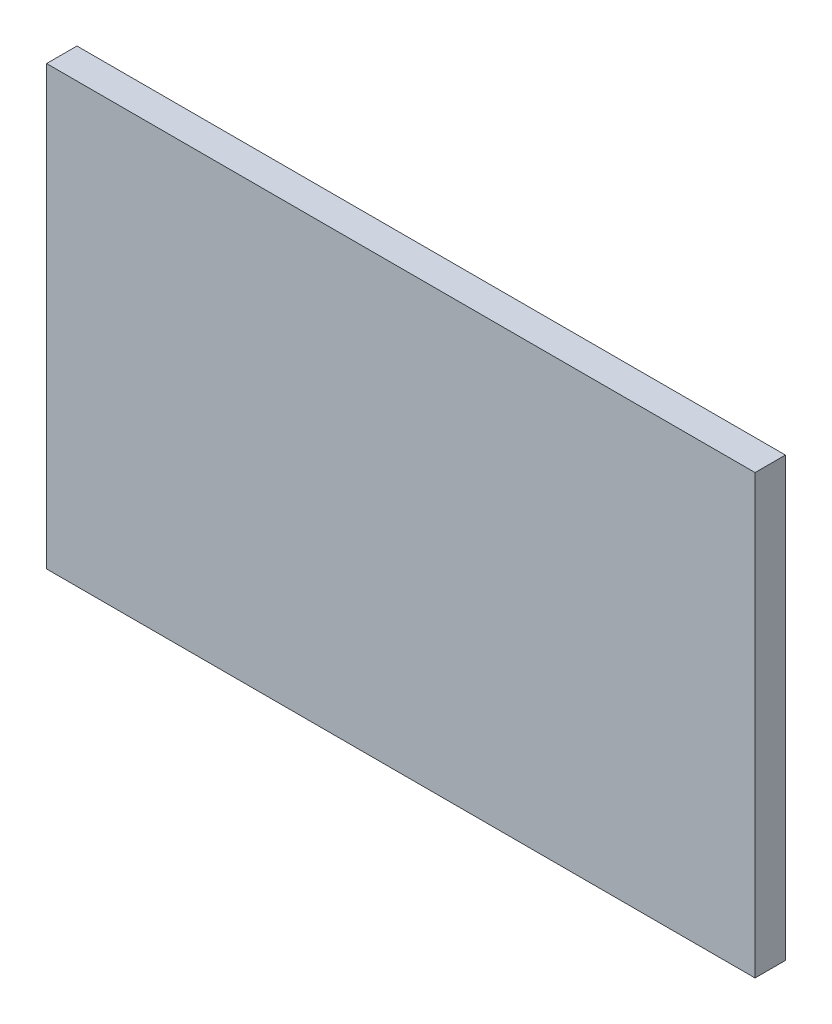
ISO-10303-21;
HEADER;
FILE_DESCRIPTION(('STEP AP214'),'2;1');
FILE_NAME('part.step','',(''),(''),'','','');
FILE_SCHEMA(('AUTOMOTIVE_DESIGN { 1 0 10303 214 1 1 1 1 }'));
ENDSEC;
DATA;
#1=APPLICATION_CONTEXT('core data for automotive mechanical design processes');
#2=APPLICATION_PROTOCOL_DEFINITION('international standard','automotive_design',2000,#1);
#3=PRODUCT_CONTEXT('',#1,'mechanical');
#4=PRODUCT('Part','Part','',(#3));
#5=PRODUCT_RELATED_PRODUCT_CATEGORY('part','',(#4));
#6=PRODUCT_DEFINITION_FORMATION('','',#4);
#7=PRODUCT_DEFINITION_CONTEXT('part definition',#1,'design');
#8=PRODUCT_DEFINITION('design','',#6,#7);
#9=PRODUCT_DEFINITION_SHAPE('','',#8);
#10=(LENGTH_UNIT() NAMED_UNIT(*) SI_UNIT(.MILLI.,.METRE.));
#11=(NAMED_UNIT(*) PLANE_ANGLE_UNIT() SI_UNIT($,.RADIAN.));
#12=(NAMED_UNIT(*) SI_UNIT($,.STERADIAN.) SOLID_ANGLE_UNIT());
#13=UNCERTAINTY_MEASURE_WITH_UNIT(LENGTH_MEASURE(1.E-05),#10,'distance_accuracy_value','');
#14=(GEOMETRIC_REPRESENTATION_CONTEXT(3) GLOBAL_UNCERTAINTY_ASSIGNED_CONTEXT((#13)) GLOBAL_UNIT_ASSIGNED_CONTEXT((#10,
#11,#12)) REPRESENTATION_CONTEXT('',''));
#15=CARTESIAN_POINT('',(0.,0.,0.));
#16=DIRECTION('',(0.,0.,1.));
#17=DIRECTION('',(1.,0.,0.));
#18=AXIS2_PLACEMENT_3D('',#15,#16,#17);
#19=CARTESIAN_POINT('',(-47.2,-9.9,-4.37));
#20=DIRECTION('',(-1.,0.,0.));
#21=DIRECTION('',(0.,0.,1.));
#22=AXIS2_PLACEMENT_3D('',#19,#20,#21);
#23=PLANE('',#22);
#24=DIRECTION('',(0.,-1.,0.));
#25=VECTOR('',#24,1.);
#26=CARTESIAN_POINT('',(-47.2,-9.9,-3.17));
#27=LINE('',#26,#25);
#28=CARTESIAN_POINT('',(-47.2,-9.9,-3.17));
#29=VERTEX_POINT('',#28);
#30=CARTESIAN_POINT('',(-47.2,-27.2,-3.17));
#31=VERTEX_POINT('',#30);
#32=EDGE_CURVE('E205',#29,#31,#27,.T.);
#33=ORIENTED_EDGE('',*,*,#32,.F.);
#34=DIRECTION('',(0.,0.,1.));
#35=VECTOR('',#34,1.);
#36=CARTESIAN_POINT('',(-47.2,-9.9,-4.37));
#37=LINE('',#36,#35);
#38=CARTESIAN_POINT('',(-47.2,-9.9,-4.37));
#39=VERTEX_POINT('',#38);
#40=EDGE_CURVE('E50',#39,#29,#37,.T.);
#41=ORIENTED_EDGE('',*,*,#40,.F.);
#42=DIRECTION('',(0.,-1.,0.));
#43=VECTOR('',#42,1.);
#44=CARTESIAN_POINT('',(-47.2,-9.9,-4.37));
#45=LINE('',#44,#43);
#46=CARTESIAN_POINT('',(-47.2,-14.08,-4.37));
#47=VERTEX_POINT('',#46);
#48=EDGE_CURVE('E208',#39,#47,#45,.T.);
#49=ORIENTED_EDGE('',*,*,#48,.T.);
#50=CARTESIAN_POINT('',(-47.2,-23.02,-4.37));
#51=VERTEX_POINT('',#50);
#52=EDGE_CURVE('E215',#47,#51,#45,.T.);
#53=ORIENTED_EDGE('',*,*,#52,.T.);
#54=CARTESIAN_POINT('',(-47.2,-27.2,-4.37));
#55=VERTEX_POINT('',#54);
#56=EDGE_CURVE('E213',#51,#55,#45,.T.);
#57=ORIENTED_EDGE('',*,*,#56,.T.);
#58=DIRECTION('',(0.,0.,1.));
#59=VECTOR('',#58,1.);
#60=CARTESIAN_POINT('',(-47.2,-27.2,-4.37));
#61=LINE('',#60,#59);
#62=EDGE_CURVE('E45',#55,#31,#61,.T.);
#63=ORIENTED_EDGE('',*,*,#62,.T.);
#64=EDGE_LOOP('',(#33,#41,#49,#53,#57,#63));
#65=FACE_BOUND('',#64,.T.);
#66=ADVANCED_FACE('F39',(#65),#23,.T.);
#67=CARTESIAN_POINT('',(-19.2,-9.9,-4.37));
#68=DIRECTION('',(0.,1.,0.));
#69=DIRECTION('',(0.,0.,1.));
#70=AXIS2_PLACEMENT_3D('',#67,#68,#69);
#71=PLANE('',#70);
#72=DIRECTION('',(-1.,0.,0.));
#73=VECTOR('',#72,1.);
#74=CARTESIAN_POINT('',(-19.2,-9.9,-3.17));
#75=LINE('',#74,#73);
#76=CARTESIAN_POINT('',(-19.2,-9.9,-3.17));
#77=VERTEX_POINT('',#76);
#78=EDGE_CURVE('E228',#77,#29,#75,.T.);
#79=ORIENTED_EDGE('',*,*,#78,.F.);
#80=DIRECTION('',(0.,0.,1.));
#81=VECTOR('',#80,1.);
#82=CARTESIAN_POINT('',(-19.2,-9.9,-4.37));
#83=LINE('',#82,#81);
#84=CARTESIAN_POINT('',(-19.2,-9.9,-4.37));
#85=VERTEX_POINT('',#84);
#86=EDGE_CURVE('E234',#85,#77,#83,.T.);
#87=ORIENTED_EDGE('',*,*,#86,.F.);
#88=DIRECTION('',(-1.,0.,0.));
#89=VECTOR('',#88,1.);
#90=CARTESIAN_POINT('',(-19.2,-9.9,-4.37));
#91=LINE('',#90,#89);
#92=EDGE_CURVE('E218',#85,#39,#91,.T.);
#93=ORIENTED_EDGE('',*,*,#92,.T.);
#94=ORIENTED_EDGE('',*,*,#40,.T.);
#95=EDGE_LOOP('',(#79,#87,#93,#94));
#96=FACE_BOUND('',#95,.T.);
#97=ADVANCED_FACE('F246',(#96),#71,.T.);
#98=CARTESIAN_POINT('',(-19.2,-27.2,-4.37));
#99=DIRECTION('',(1.,0.,0.));
#100=DIRECTION('',(0.,0.,-1.));
#101=AXIS2_PLACEMENT_3D('',#98,#99,#100);
#102=PLANE('',#101);
#103=DIRECTION('',(0.,1.,0.));
#104=VECTOR('',#103,1.);
#105=CARTESIAN_POINT('',(-19.2,-27.2,-3.17));
#106=LINE('',#105,#104);
#107=CARTESIAN_POINT('',(-19.2,-27.2,-3.17));
#108=VERTEX_POINT('',#107);
#109=EDGE_CURVE('E230',#108,#77,#106,.T.);
#110=ORIENTED_EDGE('',*,*,#109,.F.);
#111=DIRECTION('',(0.,0.,1.));
#112=VECTOR('',#111,1.);
#113=CARTESIAN_POINT('',(-19.2,-27.2,-4.37));
#114=LINE('',#113,#112);
#115=CARTESIAN_POINT('',(-19.2,-27.2,-4.37));
#116=VERTEX_POINT('',#115);
#117=EDGE_CURVE('E231',#116,#108,#114,.T.);
#118=ORIENTED_EDGE('',*,*,#117,.F.);
#119=DIRECTION('',(0.,1.,0.));
#120=VECTOR('',#119,1.);
#121=CARTESIAN_POINT('',(-19.2,-27.2,-4.37));
#122=LINE('',#121,#120);
#123=EDGE_CURVE('E216',#116,#85,#122,.T.);
#124=ORIENTED_EDGE('',*,*,#123,.T.);
#125=ORIENTED_EDGE('',*,*,#86,.T.);
#126=EDGE_LOOP('',(#110,#118,#124,#125));
#127=FACE_BOUND('',#126,.T.);
#128=ADVANCED_FACE('F273',(#127),#102,.T.);
#129=CARTESIAN_POINT('',(-47.2,-27.2,-4.37));
#130=DIRECTION('',(0.,-1.,0.));
#131=DIRECTION('',(0.,0.,-1.));
#132=AXIS2_PLACEMENT_3D('',#129,#130,#131);
#133=PLANE('',#132);
#134=DIRECTION('',(1.,0.,0.));
#135=VECTOR('',#134,1.);
#136=CARTESIAN_POINT('',(-47.2,-27.2,-3.17));
#137=LINE('',#136,#135);
#138=EDGE_CURVE('E221',#31,#108,#137,.T.);
#139=ORIENTED_EDGE('',*,*,#138,.F.);
#140=ORIENTED_EDGE('',*,*,#62,.F.);
#141=DIRECTION('',(1.,0.,0.));
#142=VECTOR('',#141,1.);
#143=CARTESIAN_POINT('',(-47.2,-27.2,-4.37));
#144=LINE('',#143,#142);
#145=EDGE_CURVE('E211',#55,#116,#144,.T.);
#146=ORIENTED_EDGE('',*,*,#145,.T.);
#147=ORIENTED_EDGE('',*,*,#117,.T.);
#148=EDGE_LOOP('',(#139,#140,#146,#147));
#149=FACE_BOUND('',#148,.T.);
#150=ADVANCED_FACE('F243',(#149),#133,.T.);
#151=CARTESIAN_POINT('',(0.,0.,-4.37));
#152=DIRECTION('',(0.,0.,1.));
#153=DIRECTION('',(1.,0.,0.));
#154=AXIS2_PLACEMENT_3D('',#151,#152,#153);
#155=PLANE('',#154);
#156=DIRECTION('',(-1.,0.,0.));
#157=VECTOR('',#156,1.);
#158=CARTESIAN_POINT('',(-31.2,-16.05,-4.37));
#159=LINE('',#158,#157);
#160=CARTESIAN_POINT('',(-31.2,-16.05,-4.37));
#161=VERTEX_POINT('',#160);
#162=CARTESIAN_POINT('',(-36.2,-16.05,-4.37));
#163=VERTEX_POINT('',#162);
#164=EDGE_CURVE('E165',#161,#163,#159,.T.);
#165=ORIENTED_EDGE('',*,*,#164,.T.);
#166=DIRECTION('',(0.,-1.,0.));
#167=VECTOR('',#166,1.);
#168=CARTESIAN_POINT('',(-36.2,-16.05,-4.37));
#169=LINE('',#168,#167);
#170=CARTESIAN_POINT('',(-36.2,-21.05,-4.37));
#171=VERTEX_POINT('',#170);
#172=EDGE_CURVE('E166',#163,#171,#169,.T.);
#173=ORIENTED_EDGE('',*,*,#172,.T.);
#174=DIRECTION('',(1.,0.,0.));
#175=VECTOR('',#174,1.);
#176=CARTESIAN_POINT('',(-36.2,-21.05,-4.37));
#177=LINE('',#176,#175);
#178=CARTESIAN_POINT('',(-31.2,-21.05,-4.37));
#179=VERTEX_POINT('',#178);
#180=EDGE_CURVE('E142',#171,#179,#177,.T.);
#181=ORIENTED_EDGE('',*,*,#180,.T.);
#182=DIRECTION('',(0.,1.,0.));
#183=VECTOR('',#182,1.);
#184=CARTESIAN_POINT('',(-31.2,-21.05,-4.37));
#185=LINE('',#184,#183);
#186=EDGE_CURVE('E57',#179,#161,#185,.T.);
#187=ORIENTED_EDGE('',*,*,#186,.T.);
#188=EDGE_LOOP('',(#165,#173,#181,#187));
#189=FACE_BOUND('',#188,.T.);
#190=ORIENTED_EDGE('',*,*,#56,.F.);
#191=DIRECTION('',(1.,0.,0.));
#192=VECTOR('',#191,1.);
#193=CARTESIAN_POINT('',(-48.,-23.02,-4.37));
#194=LINE('',#193,#192);
#195=CARTESIAN_POINT('',(-40.65,-23.02,-4.37));
#196=VERTEX_POINT('',#195);
#197=EDGE_CURVE('E11',#51,#196,#194,.T.);
#198=ORIENTED_EDGE('',*,*,#197,.T.);
#199=DIRECTION('',(0.,1.,0.));
#200=VECTOR('',#199,1.);
#201=CARTESIAN_POINT('',(-40.65,-23.02,-4.37));
#202=LINE('',#201,#200);
#203=CARTESIAN_POINT('',(-40.65,-14.08,-4.37));
#204=VERTEX_POINT('',#203);
#205=EDGE_CURVE('E191',#196,#204,#202,.T.);
#206=ORIENTED_EDGE('',*,*,#205,.T.);
#207=DIRECTION('',(-1.,0.,0.));
#208=VECTOR('',#207,1.);
#209=CARTESIAN_POINT('',(-40.65,-14.08,-4.37));
#210=LINE('',#209,#208);
#211=EDGE_CURVE('E185',#204,#47,#210,.T.);
#212=ORIENTED_EDGE('',*,*,#211,.T.);
#213=ORIENTED_EDGE('',*,*,#48,.F.);
#214=ORIENTED_EDGE('',*,*,#92,.F.);
#215=ORIENTED_EDGE('',*,*,#123,.F.);
#216=ORIENTED_EDGE('',*,*,#145,.F.);
#217=EDGE_LOOP('',(#190,#198,#206,#212,#213,#214,#215,#216));
#218=FACE_BOUND('',#217,.T.);
#219=ADVANCED_FACE('F255',(#189,#218),#155,.F.);
#220=CARTESIAN_POINT('',(0.,0.,-3.17));
#221=DIRECTION('',(0.,0.,1.));
#222=DIRECTION('',(1.,0.,0.));
#223=AXIS2_PLACEMENT_3D('',#220,#221,#222);
#224=PLANE('',#223);
#225=ORIENTED_EDGE('',*,*,#32,.T.);
#226=ORIENTED_EDGE('',*,*,#138,.T.);
#227=ORIENTED_EDGE('',*,*,#109,.T.);
#228=ORIENTED_EDGE('',*,*,#78,.T.);
#229=EDGE_LOOP('',(#225,#226,#227,#228));
#230=FACE_BOUND('',#229,.T.);
#231=ADVANCED_FACE('F250',(#230),#224,.T.);
#232=CARTESIAN_POINT('',(0.,0.,-4.37));
#233=DIRECTION('',(0.,0.,1.));
#234=DIRECTION('',(1.,0.,0.));
#235=AXIS2_PLACEMENT_3D('',#232,#233,#234);
#236=PLANE('',#235);
#237=ORIENTED_EDGE('',*,*,#52,.F.);
#238=CARTESIAN_POINT('',(-48.,-14.08,-4.37));
#239=VERTEX_POINT('',#238);
#240=EDGE_CURVE('E61',#47,#239,#210,.T.);
#241=ORIENTED_EDGE('',*,*,#240,.T.);
#242=DIRECTION('',(0.,-1.,0.));
#243=VECTOR('',#242,1.);
#244=CARTESIAN_POINT('',(-48.,-14.08,-4.37));
#245=LINE('',#244,#243);
#246=CARTESIAN_POINT('',(-48.,-23.02,-4.37));
#247=VERTEX_POINT('',#246);
#248=EDGE_CURVE('E171',#239,#247,#245,.T.);
#249=ORIENTED_EDGE('',*,*,#248,.T.);
#250=EDGE_CURVE('E47',#247,#51,#194,.T.);
#251=ORIENTED_EDGE('',*,*,#250,.T.);
#252=EDGE_LOOP('',(#237,#241,#249,#251));
#253=FACE_BOUND('',#252,.T.);
#254=ADVANCED_FACE('F271',(#253),#236,.T.);
#255=CARTESIAN_POINT('',(-48.,-14.08,-7.63));
#256=DIRECTION('',(-1.,0.,0.));
#257=DIRECTION('',(0.,0.,1.));
#258=AXIS2_PLACEMENT_3D('',#255,#256,#257);
#259=PLANE('',#258);
#260=ORIENTED_EDGE('',*,*,#248,.F.);
#261=DIRECTION('',(0.,0.,1.));
#262=VECTOR('',#261,1.);
#263=CARTESIAN_POINT('',(-48.,-14.08,-7.63));
#264=LINE('',#263,#262);
#265=CARTESIAN_POINT('',(-48.,-14.08,-7.63));
#266=VERTEX_POINT('',#265);
#267=EDGE_CURVE('E199',#266,#239,#264,.T.);
#268=ORIENTED_EDGE('',*,*,#267,.F.);
#269=DIRECTION('',(0.,-1.,0.));
#270=VECTOR('',#269,1.);
#271=CARTESIAN_POINT('',(-48.,-14.08,-7.63));
#272=LINE('',#271,#270);
#273=CARTESIAN_POINT('',(-48.,-23.02,-7.63));
#274=VERTEX_POINT('',#273);
#275=EDGE_CURVE('E178',#266,#274,#272,.T.);
#276=ORIENTED_EDGE('',*,*,#275,.T.);
#277=DIRECTION('',(0.,0.,1.));
#278=VECTOR('',#277,1.);
#279=CARTESIAN_POINT('',(-48.,-23.02,-7.63));
#280=LINE('',#279,#278);
#281=EDGE_CURVE('E192',#274,#247,#280,.T.);
#282=ORIENTED_EDGE('',*,*,#281,.T.);
#283=EDGE_LOOP('',(#260,#268,#276,#282));
#284=FACE_BOUND('',#283,.T.);
#285=ADVANCED_FACE('F268',(#284),#259,.T.);
#286=CARTESIAN_POINT('',(-40.65,-14.08,-7.63));
#287=DIRECTION('',(0.,1.,0.));
#288=DIRECTION('',(0.,0.,1.));
#289=AXIS2_PLACEMENT_3D('',#286,#287,#288);
#290=PLANE('',#289);
#291=ORIENTED_EDGE('',*,*,#211,.F.);
#292=DIRECTION('',(0.,0.,1.));
#293=VECTOR('',#292,1.);
#294=CARTESIAN_POINT('',(-40.65,-14.08,-7.63));
#295=LINE('',#294,#293);
#296=CARTESIAN_POINT('',(-40.65,-14.08,-7.63));
#297=VERTEX_POINT('',#296);
#298=EDGE_CURVE('E201',#297,#204,#295,.T.);
#299=ORIENTED_EDGE('',*,*,#298,.F.);
#300=DIRECTION('',(-1.,0.,0.));
#301=VECTOR('',#300,1.);
#302=CARTESIAN_POINT('',(-40.65,-14.08,-7.63));
#303=LINE('',#302,#301);
#304=EDGE_CURVE('E189',#297,#266,#303,.T.);
#305=ORIENTED_EDGE('',*,*,#304,.T.);
#306=ORIENTED_EDGE('',*,*,#267,.T.);
#307=ORIENTED_EDGE('',*,*,#240,.F.);
#308=EDGE_LOOP('',(#291,#299,#305,#306,#307));
#309=FACE_BOUND('',#308,.T.);
#310=ADVANCED_FACE('F260',(#309),#290,.T.);
#311=CARTESIAN_POINT('',(-40.65,-23.02,-7.63));
#312=DIRECTION('',(1.,0.,0.));
#313=DIRECTION('',(0.,0.,-1.));
#314=AXIS2_PLACEMENT_3D('',#311,#312,#313);
#315=PLANE('',#314);
#316=ORIENTED_EDGE('',*,*,#205,.F.);
#317=DIRECTION('',(0.,0.,1.));
#318=VECTOR('',#317,1.);
#319=CARTESIAN_POINT('',(-40.65,-23.02,-7.63));
#320=LINE('',#319,#318);
#321=CARTESIAN_POINT('',(-40.65,-23.02,-7.63));
#322=VERTEX_POINT('',#321);
#323=EDGE_CURVE('E202',#322,#196,#320,.T.);
#324=ORIENTED_EDGE('',*,*,#323,.F.);
#325=DIRECTION('',(0.,1.,0.));
#326=VECTOR('',#325,1.);
#327=CARTESIAN_POINT('',(-40.65,-23.02,-7.63));
#328=LINE('',#327,#326);
#329=EDGE_CURVE('E183',#322,#297,#328,.T.);
#330=ORIENTED_EDGE('',*,*,#329,.T.);
#331=ORIENTED_EDGE('',*,*,#298,.T.);
#332=EDGE_LOOP('',(#316,#324,#330,#331));
#333=FACE_BOUND('',#332,.T.);
#334=ADVANCED_FACE('F261',(#333),#315,.T.);
#335=CARTESIAN_POINT('',(-48.,-23.02,-7.63));
#336=DIRECTION('',(0.,-1.,0.));
#337=DIRECTION('',(0.,0.,-1.));
#338=AXIS2_PLACEMENT_3D('',#335,#336,#337);
#339=PLANE('',#338);
#340=ORIENTED_EDGE('',*,*,#250,.F.);
#341=ORIENTED_EDGE('',*,*,#281,.F.);
#342=DIRECTION('',(1.,0.,0.));
#343=VECTOR('',#342,1.);
#344=CARTESIAN_POINT('',(-48.,-23.02,-7.63));
#345=LINE('',#344,#343);
#346=EDGE_CURVE('E182',#274,#322,#345,.T.);
#347=ORIENTED_EDGE('',*,*,#346,.T.);
#348=ORIENTED_EDGE('',*,*,#323,.T.);
#349=ORIENTED_EDGE('',*,*,#197,.F.);
#350=EDGE_LOOP('',(#340,#341,#347,#348,#349));
#351=FACE_BOUND('',#350,.T.);
#352=ADVANCED_FACE('F320',(#351),#339,.T.);
#353=CARTESIAN_POINT('',(0.,0.,-7.63));
#354=DIRECTION('',(0.,0.,1.));
#355=DIRECTION('',(1.,0.,0.));
#356=AXIS2_PLACEMENT_3D('',#353,#354,#355);
#357=PLANE('',#356);
#358=ORIENTED_EDGE('',*,*,#275,.F.);
#359=ORIENTED_EDGE('',*,*,#304,.F.);
#360=ORIENTED_EDGE('',*,*,#329,.F.);
#361=ORIENTED_EDGE('',*,*,#346,.F.);
#362=EDGE_LOOP('',(#358,#359,#360,#361));
#363=FACE_BOUND('',#362,.T.);
#364=ADVANCED_FACE('F264',(#363),#357,.F.);
#365=CARTESIAN_POINT('',(-36.2,-16.05,-5.97));
#366=DIRECTION('',(-1.,0.,0.));
#367=DIRECTION('',(0.,0.,1.));
#368=AXIS2_PLACEMENT_3D('',#365,#366,#367);
#369=PLANE('',#368);
#370=ORIENTED_EDGE('',*,*,#172,.F.);
#371=DIRECTION('',(0.,0.,1.));
#372=VECTOR('',#371,1.);
#373=CARTESIAN_POINT('',(-36.2,-16.05,-5.97));
#374=LINE('',#373,#372);
#375=CARTESIAN_POINT('',(-36.2,-16.05,-5.97));
#376=VERTEX_POINT('',#375);
#377=EDGE_CURVE('E161',#376,#163,#374,.T.);
#378=ORIENTED_EDGE('',*,*,#377,.F.);
#379=DIRECTION('',(0.,-1.,0.));
#380=VECTOR('',#379,1.);
#381=CARTESIAN_POINT('',(-36.2,-16.05,-5.97));
#382=LINE('',#381,#380);
#383=CARTESIAN_POINT('',(-36.2,-21.05,-5.97));
#384=VERTEX_POINT('',#383);
#385=EDGE_CURVE('E154',#376,#384,#382,.T.);
#386=ORIENTED_EDGE('',*,*,#385,.T.);
#387=DIRECTION('',(0.,0.,1.));
#388=VECTOR('',#387,1.);
#389=CARTESIAN_POINT('',(-36.2,-21.05,-5.97));
#390=LINE('',#389,#388);
#391=EDGE_CURVE('E140',#384,#171,#390,.T.);
#392=ORIENTED_EDGE('',*,*,#391,.T.);
#393=EDGE_LOOP('',(#370,#378,#386,#392));
#394=FACE_BOUND('',#393,.T.);
#395=ADVANCED_FACE('F159',(#394),#369,.T.);
#396=CARTESIAN_POINT('',(-31.2,-16.05,-5.97));
#397=DIRECTION('',(0.,1.,0.));
#398=DIRECTION('',(0.,0.,1.));
#399=AXIS2_PLACEMENT_3D('',#396,#397,#398);
#400=PLANE('',#399);
#401=ORIENTED_EDGE('',*,*,#164,.F.);
#402=DIRECTION('',(0.,0.,1.));
#403=VECTOR('',#402,1.);
#404=CARTESIAN_POINT('',(-31.2,-16.05,-5.97));
#405=LINE('',#404,#403);
#406=CARTESIAN_POINT('',(-31.2,-16.05,-5.97));
#407=VERTEX_POINT('',#406);
#408=EDGE_CURVE('E173',#407,#161,#405,.T.);
#409=ORIENTED_EDGE('',*,*,#408,.F.);
#410=DIRECTION('',(-1.,0.,0.));
#411=VECTOR('',#410,1.);
#412=CARTESIAN_POINT('',(-31.2,-16.05,-5.97));
#413=LINE('',#412,#411);
#414=EDGE_CURVE('E146',#407,#376,#413,.T.);
#415=ORIENTED_EDGE('',*,*,#414,.T.);
#416=ORIENTED_EDGE('',*,*,#377,.T.);
#417=EDGE_LOOP('',(#401,#409,#415,#416));
#418=FACE_BOUND('',#417,.T.);
#419=ADVANCED_FACE('F346',(#418),#400,.T.);
#420=CARTESIAN_POINT('',(-31.2,-21.05,-5.97));
#421=DIRECTION('',(1.,0.,0.));
#422=DIRECTION('',(0.,0.,-1.));
#423=AXIS2_PLACEMENT_3D('',#420,#421,#422);
#424=PLANE('',#423);
#425=ORIENTED_EDGE('',*,*,#186,.F.);
#426=DIRECTION('',(0.,0.,1.));
#427=VECTOR('',#426,1.);
#428=CARTESIAN_POINT('',(-31.2,-21.05,-5.97));
#429=LINE('',#428,#427);
#430=CARTESIAN_POINT('',(-31.2,-21.05,-5.97));
#431=VERTEX_POINT('',#430);
#432=EDGE_CURVE('E150',#431,#179,#429,.T.);
#433=ORIENTED_EDGE('',*,*,#432,.F.);
#434=DIRECTION('',(0.,1.,0.));
#435=VECTOR('',#434,1.);
#436=CARTESIAN_POINT('',(-31.2,-21.05,-5.97));
#437=LINE('',#436,#435);
#438=EDGE_CURVE('E158',#431,#407,#437,.T.);
#439=ORIENTED_EDGE('',*,*,#438,.T.);
#440=ORIENTED_EDGE('',*,*,#408,.T.);
#441=EDGE_LOOP('',(#425,#433,#439,#440));
#442=FACE_BOUND('',#441,.T.);
#443=ADVANCED_FACE('F357',(#442),#424,.T.);
#444=CARTESIAN_POINT('',(-36.2,-21.05,-5.97));
#445=DIRECTION('',(0.,-1.,0.));
#446=DIRECTION('',(0.,0.,-1.));
#447=AXIS2_PLACEMENT_3D('',#444,#445,#446);
#448=PLANE('',#447);
#449=ORIENTED_EDGE('',*,*,#180,.F.);
#450=ORIENTED_EDGE('',*,*,#391,.F.);
#451=DIRECTION('',(1.,0.,0.));
#452=VECTOR('',#451,1.);
#453=CARTESIAN_POINT('',(-36.2,-21.05,-5.97));
#454=LINE('',#453,#452);
#455=EDGE_CURVE('E136',#384,#431,#454,.T.);
#456=ORIENTED_EDGE('',*,*,#455,.T.);
#457=ORIENTED_EDGE('',*,*,#432,.T.);
#458=EDGE_LOOP('',(#449,#450,#456,#457));
#459=FACE_BOUND('',#458,.T.);
#460=ADVANCED_FACE('F139',(#459),#448,.T.);
#461=CARTESIAN_POINT('',(0.,0.,-5.97));
#462=DIRECTION('',(0.,0.,1.));
#463=DIRECTION('',(1.,0.,0.));
#464=AXIS2_PLACEMENT_3D('',#461,#462,#463);
#465=PLANE('',#464);
#466=ORIENTED_EDGE('',*,*,#385,.F.);
#467=ORIENTED_EDGE('',*,*,#414,.F.);
#468=ORIENTED_EDGE('',*,*,#438,.F.);
#469=ORIENTED_EDGE('',*,*,#455,.F.);
#470=EDGE_LOOP('',(#466,#467,#468,#469));
#471=FACE_BOUND('',#470,.T.);
#472=ADVANCED_FACE('F153',(#471),#465,.F.);
#473=CLOSED_SHELL('',(#66,#97,#128,#150,#219,#231,#254,#285,#310,#334,#352,#364,#395,#419,#443,
#460,#472));
#474=MANIFOLD_SOLID_BREP('B2',#473);
#475=ADVANCED_BREP_SHAPE_REPRESENTATION('',(#18,#474),#14);
#476=SHAPE_DEFINITION_REPRESENTATION(#9,#475);
ENDSEC;
END-ISO-10303-21;
